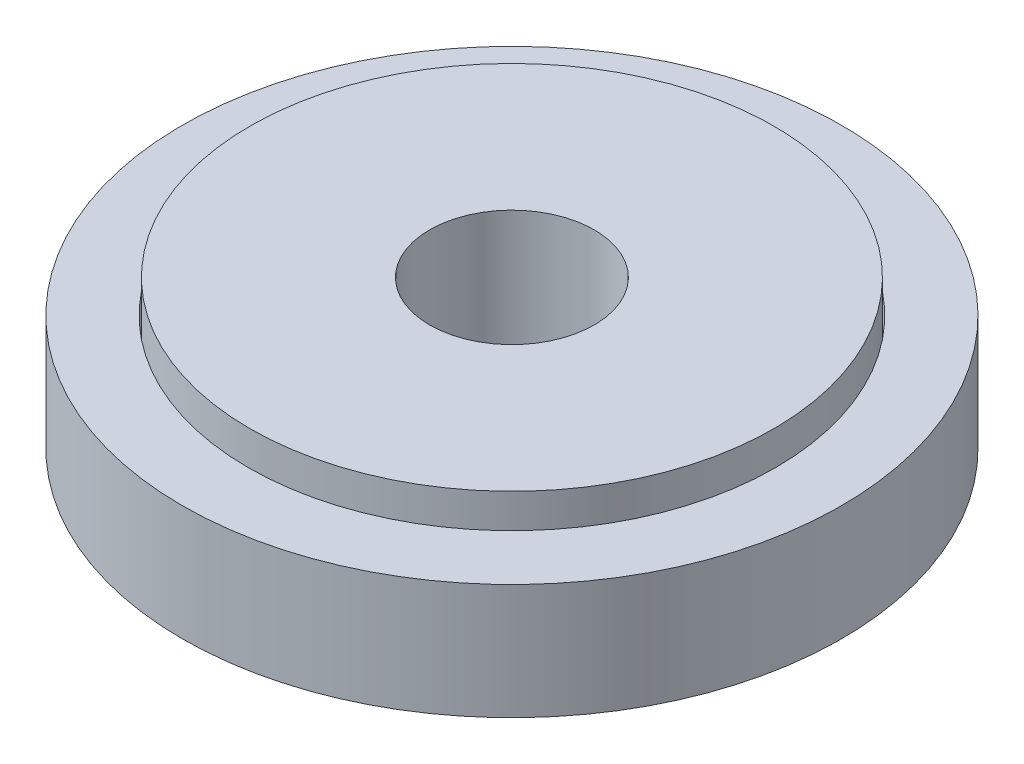
ISO-10303-21;
HEADER;
FILE_DESCRIPTION(('STEP AP214'),'2;1');
FILE_NAME('part.step','',(''),(''),'','','');
FILE_SCHEMA(('AUTOMOTIVE_DESIGN { 1 0 10303 214 1 1 1 1 }'));
ENDSEC;
DATA;
#1=APPLICATION_CONTEXT('core data for automotive mechanical design processes');
#2=APPLICATION_PROTOCOL_DEFINITION('international standard','automotive_design',2000,#1);
#3=PRODUCT_CONTEXT('',#1,'mechanical');
#4=PRODUCT('Part','Part','',(#3));
#5=PRODUCT_RELATED_PRODUCT_CATEGORY('part','',(#4));
#6=PRODUCT_DEFINITION_FORMATION('','',#4);
#7=PRODUCT_DEFINITION_CONTEXT('part definition',#1,'design');
#8=PRODUCT_DEFINITION('design','',#6,#7);
#9=PRODUCT_DEFINITION_SHAPE('','',#8);
#10=(LENGTH_UNIT() NAMED_UNIT(*) SI_UNIT(.MILLI.,.METRE.));
#11=(NAMED_UNIT(*) PLANE_ANGLE_UNIT() SI_UNIT($,.RADIAN.));
#12=(NAMED_UNIT(*) SI_UNIT($,.STERADIAN.) SOLID_ANGLE_UNIT());
#13=UNCERTAINTY_MEASURE_WITH_UNIT(LENGTH_MEASURE(1.E-05),#10,'distance_accuracy_value','');
#14=(GEOMETRIC_REPRESENTATION_CONTEXT(3) GLOBAL_UNCERTAINTY_ASSIGNED_CONTEXT((#13)) GLOBAL_UNIT_ASSIGNED_CONTEXT((#10,
#11,#12)) REPRESENTATION_CONTEXT('',''));
#15=CARTESIAN_POINT('',(0.,0.,0.));
#16=DIRECTION('',(0.,0.,1.));
#17=DIRECTION('',(1.,0.,0.));
#18=AXIS2_PLACEMENT_3D('',#15,#16,#17);
#19=CARTESIAN_POINT('',(0.,4.5,0.));
#20=DIRECTION('',(0.,-1.,0.));
#21=DIRECTION('',(0.,0.,-1.));
#22=AXIS2_PLACEMENT_3D('',#19,#20,#21);
#23=CYLINDRICAL_SURFACE('',#22,7.95);
#24=CARTESIAN_POINT('',(0.,4.5,0.));
#25=DIRECTION('',(0.,1.,0.));
#26=DIRECTION('',(0.,0.,1.));
#27=AXIS2_PLACEMENT_3D('',#24,#25,#26);
#28=CIRCLE('',#27,7.95);
#29=CARTESIAN_POINT('',(0.,4.5,7.95));
#30=VERTEX_POINT('',#29);
#31=EDGE_CURVE('E12',#30,#30,#28,.T.);
#32=ORIENTED_EDGE('',*,*,#31,.F.);
#33=EDGE_LOOP('',(#32));
#34=FACE_BOUND('',#33,.T.);
#35=CARTESIAN_POINT('',(0.,0.,0.));
#36=DIRECTION('',(0.,1.,0.));
#37=DIRECTION('',(0.,0.,1.));
#38=AXIS2_PLACEMENT_3D('',#35,#36,#37);
#39=CIRCLE('',#38,7.95);
#40=CARTESIAN_POINT('',(0.,0.,7.95));
#41=VERTEX_POINT('',#40);
#42=EDGE_CURVE('E56',#41,#41,#39,.T.);
#43=ORIENTED_EDGE('',*,*,#42,.T.);
#44=EDGE_LOOP('',(#43));
#45=FACE_BOUND('',#44,.T.);
#46=ADVANCED_FACE('F50',(#34,#45),#23,.T.);
#47=CARTESIAN_POINT('',(0.,4.5,0.));
#48=DIRECTION('',(0.,1.,0.));
#49=DIRECTION('',(0.,0.,1.));
#50=AXIS2_PLACEMENT_3D('',#47,#48,#49);
#51=PLANE('',#50);
#52=CARTESIAN_POINT('',(0.,4.5,0.));
#53=DIRECTION('',(0.,1.,0.));
#54=DIRECTION('',(0.,0.,1.));
#55=AXIS2_PLACEMENT_3D('',#52,#53,#54);
#56=CIRCLE('',#55,2.5);
#57=CARTESIAN_POINT('',(0.,4.5,2.5));
#58=VERTEX_POINT('',#57);
#59=EDGE_CURVE('E64',#58,#58,#56,.T.);
#60=ORIENTED_EDGE('',*,*,#59,.F.);
#61=EDGE_LOOP('',(#60));
#62=FACE_BOUND('',#61,.T.);
#63=ORIENTED_EDGE('',*,*,#31,.T.);
#64=EDGE_LOOP('',(#63));
#65=FACE_BOUND('',#64,.T.);
#66=ADVANCED_FACE('F73',(#62,#65),#51,.T.);
#67=CARTESIAN_POINT('',(0.,0.,0.));
#68=DIRECTION('',(0.,1.,0.));
#69=DIRECTION('',(0.,0.,1.));
#70=AXIS2_PLACEMENT_3D('',#67,#68,#69);
#71=PLANE('',#70);
#72=CARTESIAN_POINT('',(0.,0.,0.));
#73=DIRECTION('',(0.,1.,0.));
#74=DIRECTION('',(0.,0.,1.));
#75=AXIS2_PLACEMENT_3D('',#72,#73,#74);
#76=CIRCLE('',#75,2.5);
#77=CARTESIAN_POINT('',(0.,0.,2.5));
#78=VERTEX_POINT('',#77);
#79=EDGE_CURVE('E60',#78,#78,#76,.F.);
#80=ORIENTED_EDGE('',*,*,#79,.F.);
#81=EDGE_LOOP('',(#80));
#82=FACE_BOUND('',#81,.T.);
#83=ORIENTED_EDGE('',*,*,#42,.F.);
#84=EDGE_LOOP('',(#83));
#85=FACE_BOUND('',#84,.T.);
#86=ADVANCED_FACE('F75',(#82,#85),#71,.F.);
#87=CARTESIAN_POINT('',(0.,-0.00100000000000013,0.));
#88=DIRECTION('',(0.,1.,0.));
#89=DIRECTION('',(0.,0.,1.));
#90=AXIS2_PLACEMENT_3D('',#87,#88,#89);
#91=CYLINDRICAL_SURFACE('',#90,2.5);
#92=ORIENTED_EDGE('',*,*,#59,.T.);
#93=EDGE_LOOP('',(#92));
#94=FACE_BOUND('',#93,.T.);
#95=ORIENTED_EDGE('',*,*,#79,.T.);
#96=EDGE_LOOP('',(#95));
#97=FACE_BOUND('',#96,.T.);
#98=ADVANCED_FACE('F70',(#94,#97),#91,.F.);
#99=CLOSED_SHELL('',(#46,#66,#86,#98));
#100=MANIFOLD_SOLID_BREP('B2',#99);
#101=CARTESIAN_POINT('',(0.,3.5,0.));
#102=DIRECTION('',(0.,1.,0.));
#103=DIRECTION('',(0.,0.,1.));
#104=AXIS2_PLACEMENT_3D('',#101,#102,#103);
#105=PLANE('',#104);
#106=CARTESIAN_POINT('',(0.,3.5,0.));
#107=DIRECTION('',(0.,1.,0.));
#108=DIRECTION('',(0.,0.,1.));
#109=AXIS2_PLACEMENT_3D('',#106,#107,#108);
#110=CIRCLE('',#109,10.);
#111=CARTESIAN_POINT('',(0.,3.5,10.));
#112=VERTEX_POINT('',#111);
#113=EDGE_CURVE('E49',#112,#112,#110,.T.);
#114=ORIENTED_EDGE('',*,*,#113,.T.);
#115=EDGE_LOOP('',(#114));
#116=FACE_BOUND('',#115,.T.);
#117=CARTESIAN_POINT('',(0.,3.5,0.));
#118=DIRECTION('',(0.,1.,0.));
#119=DIRECTION('',(1.,0.,0.));
#120=AXIS2_PLACEMENT_3D('',#117,#118,#119);
#121=CIRCLE('',#120,8.);
#122=CARTESIAN_POINT('',(8.,3.5,0.));
#123=VERTEX_POINT('',#122);
#124=EDGE_CURVE('E122',#123,#123,#121,.T.);
#125=ORIENTED_EDGE('',*,*,#124,.F.);
#126=EDGE_LOOP('',(#125));
#127=FACE_BOUND('',#126,.T.);
#128=ADVANCED_FACE('F111',(#116,#127),#105,.T.);
#129=CARTESIAN_POINT('',(0.,0.,0.));
#130=DIRECTION('',(0.,1.,0.));
#131=DIRECTION('',(0.,0.,1.));
#132=AXIS2_PLACEMENT_3D('',#129,#130,#131);
#133=PLANE('',#132);
#134=CARTESIAN_POINT('',(0.,0.,0.));
#135=DIRECTION('',(0.,1.,0.));
#136=DIRECTION('',(0.,0.,1.));
#137=AXIS2_PLACEMENT_3D('',#134,#135,#136);
#138=CIRCLE('',#137,10.);
#139=CARTESIAN_POINT('',(0.,0.,10.));
#140=VERTEX_POINT('',#139);
#141=EDGE_CURVE('E115',#140,#140,#138,.T.);
#142=ORIENTED_EDGE('',*,*,#141,.F.);
#143=EDGE_LOOP('',(#142));
#144=FACE_BOUND('',#143,.T.);
#145=CARTESIAN_POINT('',(0.,0.,0.));
#146=DIRECTION('',(0.,1.,0.));
#147=DIRECTION('',(1.,0.,0.));
#148=AXIS2_PLACEMENT_3D('',#145,#146,#147);
#149=CIRCLE('',#148,8.);
#150=CARTESIAN_POINT('',(8.,0.,0.));
#151=VERTEX_POINT('',#150);
#152=EDGE_CURVE('E124',#151,#151,#149,.T.);
#153=ORIENTED_EDGE('',*,*,#152,.T.);
#154=EDGE_LOOP('',(#153));
#155=FACE_BOUND('',#154,.T.);
#156=ADVANCED_FACE('F134',(#144,#155),#133,.F.);
#157=CARTESIAN_POINT('',(0.,3.5,0.));
#158=DIRECTION('',(0.,-1.,0.));
#159=DIRECTION('',(0.,0.,-1.));
#160=AXIS2_PLACEMENT_3D('',#157,#158,#159);
#161=CYLINDRICAL_SURFACE('',#160,10.);
#162=ORIENTED_EDGE('',*,*,#113,.F.);
#163=EDGE_LOOP('',(#162));
#164=FACE_BOUND('',#163,.T.);
#165=ORIENTED_EDGE('',*,*,#141,.T.);
#166=EDGE_LOOP('',(#165));
#167=FACE_BOUND('',#166,.T.);
#168=ADVANCED_FACE('F113',(#164,#167),#161,.T.);
#169=CARTESIAN_POINT('',(0.,3.5,0.));
#170=DIRECTION('',(0.,-1.,0.));
#171=DIRECTION('',(0.,0.,-1.));
#172=AXIS2_PLACEMENT_3D('',#169,#170,#171);
#173=CYLINDRICAL_SURFACE('',#172,8.);
#174=ORIENTED_EDGE('',*,*,#124,.T.);
#175=EDGE_LOOP('',(#174));
#176=FACE_BOUND('',#175,.T.);
#177=ORIENTED_EDGE('',*,*,#152,.F.);
#178=EDGE_LOOP('',(#177));
#179=FACE_BOUND('',#178,.T.);
#180=ADVANCED_FACE('F130',(#176,#179),#173,.F.);
#181=CLOSED_SHELL('',(#128,#156,#168,#180));
#182=MANIFOLD_SOLID_BREP('B7',#181);
#183=ADVANCED_BREP_SHAPE_REPRESENTATION('',(#18,#100,#182),#14);
#184=SHAPE_DEFINITION_REPRESENTATION(#9,#183);
ENDSEC;
END-ISO-10303-21;
